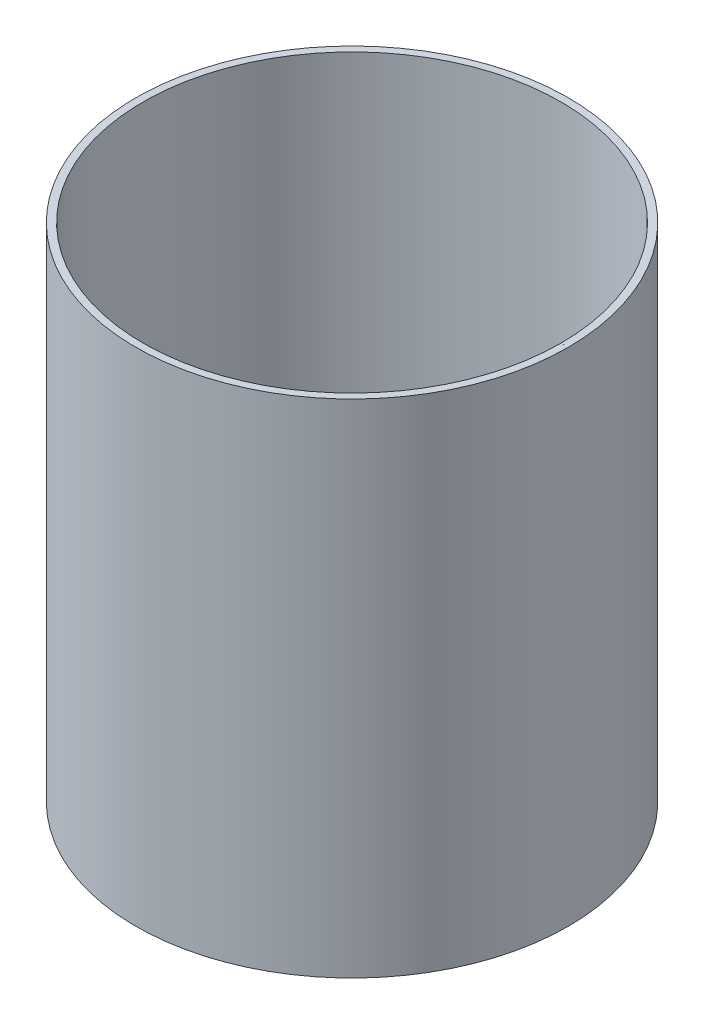
ISO-10303-21;
HEADER;
FILE_DESCRIPTION(('STEP AP214'),'2;1');
FILE_NAME('part.step','',(''),(''),'','','');
FILE_SCHEMA(('AUTOMOTIVE_DESIGN { 1 0 10303 214 1 1 1 1 }'));
ENDSEC;
DATA;
#1=APPLICATION_CONTEXT('core data for automotive mechanical design processes');
#2=APPLICATION_PROTOCOL_DEFINITION('international standard','automotive_design',2000,#1);
#3=PRODUCT_CONTEXT('',#1,'mechanical');
#4=PRODUCT('Part','Part','',(#3));
#5=PRODUCT_RELATED_PRODUCT_CATEGORY('part','',(#4));
#6=PRODUCT_DEFINITION_FORMATION('','',#4);
#7=PRODUCT_DEFINITION_CONTEXT('part definition',#1,'design');
#8=PRODUCT_DEFINITION('design','',#6,#7);
#9=PRODUCT_DEFINITION_SHAPE('','',#8);
#10=(LENGTH_UNIT() NAMED_UNIT(*) SI_UNIT(.MILLI.,.METRE.));
#11=(NAMED_UNIT(*) PLANE_ANGLE_UNIT() SI_UNIT($,.RADIAN.));
#12=(NAMED_UNIT(*) SI_UNIT($,.STERADIAN.) SOLID_ANGLE_UNIT());
#13=UNCERTAINTY_MEASURE_WITH_UNIT(LENGTH_MEASURE(1.E-05),#10,'distance_accuracy_value','');
#14=(GEOMETRIC_REPRESENTATION_CONTEXT(3) GLOBAL_UNCERTAINTY_ASSIGNED_CONTEXT((#13)) GLOBAL_UNIT_ASSIGNED_CONTEXT((#10,
#11,#12)) REPRESENTATION_CONTEXT('',''));
#15=CARTESIAN_POINT('',(0.,0.,0.));
#16=DIRECTION('',(0.,0.,1.));
#17=DIRECTION('',(1.,0.,0.));
#18=AXIS2_PLACEMENT_3D('',#15,#16,#17);
#19=CARTESIAN_POINT('',(0.,0.,0.));
#20=DIRECTION('',(0.,-1.,0.));
#21=DIRECTION('',(0.,0.,-1.));
#22=AXIS2_PLACEMENT_3D('',#19,#20,#21);
#23=CYLINDRICAL_SURFACE('',#22,776.);
#24=CARTESIAN_POINT('',(0.,900.,0.));
#25=DIRECTION('',(0.,-1.,0.));
#26=DIRECTION('',(0.,0.,-1.));
#27=AXIS2_PLACEMENT_3D('',#24,#25,#26);
#28=CIRCLE('',#27,776.);
#29=CARTESIAN_POINT('',(775.999988180844,900.,0.135437549256303));
#30=VERTEX_POINT('',#29);
#31=CARTESIAN_POINT('',(776.,900.,0.));
#32=VERTEX_POINT('',#31);
#33=EDGE_CURVE('E11',#30,#32,#28,.T.);
#34=ORIENTED_EDGE('',*,*,#33,.T.);
#35=DIRECTION('',(0.,1.,0.));
#36=VECTOR('',#35,1.);
#37=CARTESIAN_POINT('',(776.,900.,0.));
#38=LINE('',#37,#36);
#39=CARTESIAN_POINT('',(776.,-900.,0.));
#40=VERTEX_POINT('',#39);
#41=EDGE_CURVE('E82',#40,#32,#38,.T.);
#42=ORIENTED_EDGE('',*,*,#41,.F.);
#43=CARTESIAN_POINT('',(0.,-900.,0.));
#44=DIRECTION('',(0.,-1.,0.));
#45=DIRECTION('',(0.,0.,-1.));
#46=AXIS2_PLACEMENT_3D('',#43,#44,#45);
#47=CIRCLE('',#46,776.);
#48=CARTESIAN_POINT('',(775.999988180845,-900.,0.135437549256303));
#49=VERTEX_POINT('',#48);
#50=EDGE_CURVE('E57',#49,#40,#47,.T.);
#51=ORIENTED_EDGE('',*,*,#50,.F.);
#52=DIRECTION('',(0.,1.,0.));
#53=VECTOR('',#52,1.);
#54=CARTESIAN_POINT('',(775.999988180844,900.,0.135437549256303));
#55=LINE('',#54,#53);
#56=EDGE_CURVE('E84',#49,#30,#55,.T.);
#57=ORIENTED_EDGE('',*,*,#56,.T.);
#58=EDGE_LOOP('',(#34,#42,#51,#57));
#59=FACE_BOUND('',#58,.T.);
#60=ADVANCED_FACE('F41',(#59),#23,.T.);
#61=CARTESIAN_POINT('',(749.999988576847,900.,0.13089969322452));
#62=DIRECTION('',(0.,1.,0.));
#63=DIRECTION('',(0.,0.,1.));
#64=AXIS2_PLACEMENT_3D('',#61,#62,#63);
#65=PLANE('',#64);
#66=CARTESIAN_POINT('',(0.,900.,0.));
#67=DIRECTION('',(0.,-1.,0.));
#68=DIRECTION('',(0.,0.,-1.));
#69=AXIS2_PLACEMENT_3D('',#66,#67,#68);
#70=CIRCLE('',#69,750.);
#71=CARTESIAN_POINT('',(749.999988576847,900.,0.13089969322452));
#72=VERTEX_POINT('',#71);
#73=CARTESIAN_POINT('',(750.,900.,0.));
#74=VERTEX_POINT('',#73);
#75=EDGE_CURVE('E50',#72,#74,#70,.T.);
#76=ORIENTED_EDGE('',*,*,#75,.T.);
#77=DIRECTION('',(-1.,0.,0.));
#78=VECTOR('',#77,1.);
#79=CARTESIAN_POINT('',(750.,900.,0.));
#80=LINE('',#79,#78);
#81=EDGE_CURVE('E93',#32,#74,#80,.T.);
#82=ORIENTED_EDGE('',*,*,#81,.F.);
#83=ORIENTED_EDGE('',*,*,#33,.F.);
#84=DIRECTION('',(-0.999999984769129,0.,-0.00017453292429936));
#85=VECTOR('',#84,1.);
#86=CARTESIAN_POINT('',(749.999988576847,900.,0.13089969322452));
#87=LINE('',#86,#85);
#88=EDGE_CURVE('E108',#30,#72,#87,.T.);
#89=ORIENTED_EDGE('',*,*,#88,.T.);
#90=EDGE_LOOP('',(#76,#82,#83,#89));
#91=FACE_BOUND('',#90,.T.);
#92=ADVANCED_FACE('F43',(#91),#65,.T.);
#93=CARTESIAN_POINT('',(0.,0.,0.));
#94=DIRECTION('',(0.,-1.,0.));
#95=DIRECTION('',(0.,0.,-1.));
#96=AXIS2_PLACEMENT_3D('',#93,#94,#95);
#97=CYLINDRICAL_SURFACE('',#96,750.);
#98=CARTESIAN_POINT('',(0.,-900.,0.));
#99=DIRECTION('',(0.,-1.,0.));
#100=DIRECTION('',(0.,0.,-1.));
#101=AXIS2_PLACEMENT_3D('',#98,#99,#100);
#102=CIRCLE('',#101,750.);
#103=CARTESIAN_POINT('',(749.999988576847,-900.,0.13089969322452));
#104=VERTEX_POINT('',#103);
#105=CARTESIAN_POINT('',(750.,-900.,0.));
#106=VERTEX_POINT('',#105);
#107=EDGE_CURVE('E65',#104,#106,#102,.T.);
#108=ORIENTED_EDGE('',*,*,#107,.T.);
#109=DIRECTION('',(0.,-1.,0.));
#110=VECTOR('',#109,1.);
#111=CARTESIAN_POINT('',(750.,900.,0.));
#112=LINE('',#111,#110);
#113=EDGE_CURVE('E99',#74,#106,#112,.T.);
#114=ORIENTED_EDGE('',*,*,#113,.F.);
#115=ORIENTED_EDGE('',*,*,#75,.F.);
#116=DIRECTION('',(0.,-1.,0.));
#117=VECTOR('',#116,1.);
#118=CARTESIAN_POINT('',(749.999988576847,900.,0.13089969322452));
#119=LINE('',#118,#117);
#120=EDGE_CURVE('E111',#72,#104,#119,.T.);
#121=ORIENTED_EDGE('',*,*,#120,.T.);
#122=EDGE_LOOP('',(#108,#114,#115,#121));
#123=FACE_BOUND('',#122,.T.);
#124=ADVANCED_FACE('F122',(#123),#97,.F.);
#125=CARTESIAN_POINT('',(749.999988576847,-900.,0.13089969322452));
#126=DIRECTION('',(0.,-1.,0.));
#127=DIRECTION('',(0.,0.,-1.));
#128=AXIS2_PLACEMENT_3D('',#125,#126,#127);
#129=PLANE('',#128);
#130=DIRECTION('',(0.999999984769129,0.,0.00017453292429936));
#131=VECTOR('',#130,1.);
#132=CARTESIAN_POINT('',(749.999988576847,-900.,0.13089969322452));
#133=LINE('',#132,#131);
#134=EDGE_CURVE('E114',#104,#49,#133,.T.);
#135=ORIENTED_EDGE('',*,*,#134,.T.);
#136=ORIENTED_EDGE('',*,*,#50,.T.);
#137=DIRECTION('',(1.,0.,0.));
#138=VECTOR('',#137,1.);
#139=CARTESIAN_POINT('',(750.,-900.,0.));
#140=LINE('',#139,#138);
#141=EDGE_CURVE('E95',#106,#40,#140,.T.);
#142=ORIENTED_EDGE('',*,*,#141,.F.);
#143=ORIENTED_EDGE('',*,*,#107,.F.);
#144=EDGE_LOOP('',(#135,#136,#142,#143));
#145=FACE_BOUND('',#144,.T.);
#146=ADVANCED_FACE('F125',(#145),#129,.T.);
#147=CARTESIAN_POINT('',(0.,0.,0.));
#148=DIRECTION('',(-0.00017453292429936,0.,0.999999984769129));
#149=DIRECTION('',(0.999999984769129,0.,0.00017453292429936));
#150=AXIS2_PLACEMENT_3D('',#147,#148,#149);
#151=PLANE('',#150);
#152=ORIENTED_EDGE('',*,*,#56,.F.);
#153=ORIENTED_EDGE('',*,*,#134,.F.);
#154=ORIENTED_EDGE('',*,*,#120,.F.);
#155=ORIENTED_EDGE('',*,*,#88,.F.);
#156=EDGE_LOOP('',(#152,#153,#154,#155));
#157=FACE_BOUND('',#156,.T.);
#158=ADVANCED_FACE('F127',(#157),#151,.F.);
#159=CARTESIAN_POINT('',(0.,0.,0.));
#160=DIRECTION('',(0.,0.,1.));
#161=DIRECTION('',(1.,0.,0.));
#162=AXIS2_PLACEMENT_3D('',#159,#160,#161);
#163=PLANE('',#162);
#164=ORIENTED_EDGE('',*,*,#41,.T.);
#165=ORIENTED_EDGE('',*,*,#81,.T.);
#166=ORIENTED_EDGE('',*,*,#113,.T.);
#167=ORIENTED_EDGE('',*,*,#141,.T.);
#168=EDGE_LOOP('',(#164,#165,#166,#167));
#169=FACE_BOUND('',#168,.T.);
#170=ADVANCED_FACE('F91',(#169),#163,.T.);
#171=CLOSED_SHELL('',(#60,#92,#124,#146,#158,#170));
#172=MANIFOLD_SOLID_BREP('B2',#171);
#173=ADVANCED_BREP_SHAPE_REPRESENTATION('',(#18,#172),#14);
#174=SHAPE_DEFINITION_REPRESENTATION(#9,#173);
ENDSEC;
END-ISO-10303-21;
